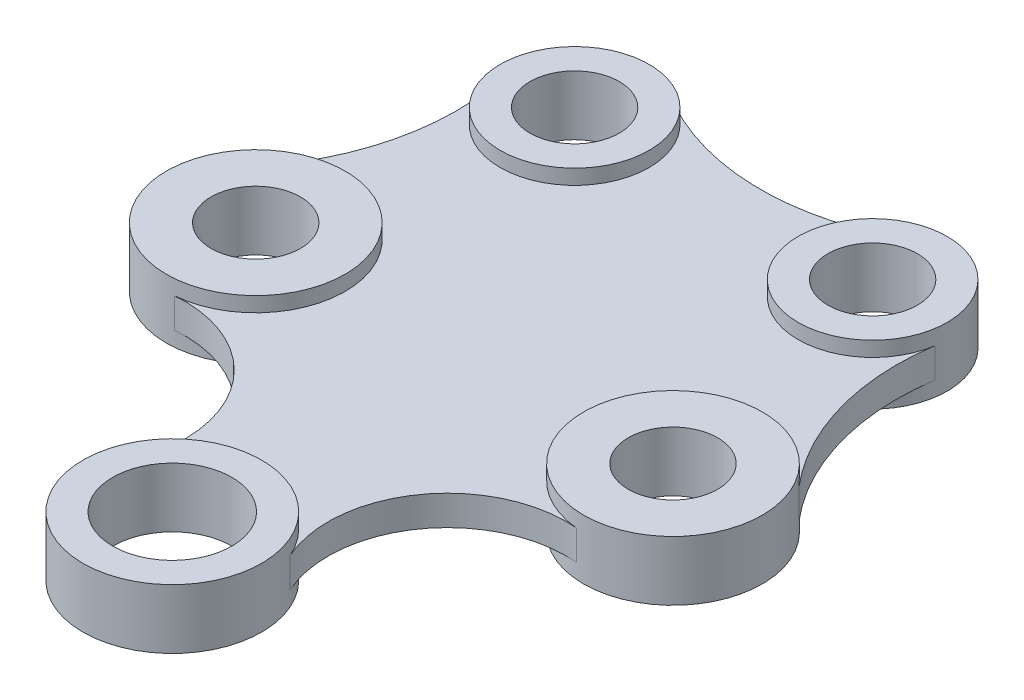
ISO-10303-21;
HEADER;
FILE_DESCRIPTION(('STEP AP214'),'2;1');
FILE_NAME('part.step','',(''),(''),'','','');
FILE_SCHEMA(('AUTOMOTIVE_DESIGN { 1 0 10303 214 1 1 1 1 }'));
ENDSEC;
DATA;
#1=APPLICATION_CONTEXT('core data for automotive mechanical design processes');
#2=APPLICATION_PROTOCOL_DEFINITION('international standard','automotive_design',2000,#1);
#3=PRODUCT_CONTEXT('',#1,'mechanical');
#4=PRODUCT('Part','Part','',(#3));
#5=PRODUCT_RELATED_PRODUCT_CATEGORY('part','',(#4));
#6=PRODUCT_DEFINITION_FORMATION('','',#4);
#7=PRODUCT_DEFINITION_CONTEXT('part definition',#1,'design');
#8=PRODUCT_DEFINITION('design','',#6,#7);
#9=PRODUCT_DEFINITION_SHAPE('','',#8);
#10=(LENGTH_UNIT() NAMED_UNIT(*) SI_UNIT(.MILLI.,.METRE.));
#11=(NAMED_UNIT(*) PLANE_ANGLE_UNIT() SI_UNIT($,.RADIAN.));
#12=(NAMED_UNIT(*) SI_UNIT($,.STERADIAN.) SOLID_ANGLE_UNIT());
#13=UNCERTAINTY_MEASURE_WITH_UNIT(LENGTH_MEASURE(1.E-05),#10,'distance_accuracy_value','');
#14=(GEOMETRIC_REPRESENTATION_CONTEXT(3) GLOBAL_UNCERTAINTY_ASSIGNED_CONTEXT((#13)) GLOBAL_UNIT_ASSIGNED_CONTEXT((#10,
#11,#12)) REPRESENTATION_CONTEXT('',''));
#15=CARTESIAN_POINT('',(0.,0.,0.));
#16=DIRECTION('',(0.,0.,1.));
#17=DIRECTION('',(1.,0.,0.));
#18=AXIS2_PLACEMENT_3D('',#15,#16,#17);
#19=CARTESIAN_POINT('',(-50.,15.,-87.));
#20=DIRECTION('',(0.,1.,0.));
#21=DIRECTION('',(0.,0.,1.));
#22=AXIS2_PLACEMENT_3D('',#19,#20,#21);
#23=PLANE('',#22);
#24=CARTESIAN_POINT('',(-50.,15.,-87.));
#25=DIRECTION('',(0.,1.,0.));
#26=DIRECTION('',(0.,0.,1.));
#27=AXIS2_PLACEMENT_3D('',#24,#25,#26);
#28=CIRCLE('',#27,15.);
#29=CARTESIAN_POINT('',(-50.,15.,-72.));
#30=VERTEX_POINT('',#29);
#31=EDGE_CURVE('E248',#30,#30,#28,.T.);
#32=ORIENTED_EDGE('',*,*,#31,.F.);
#33=EDGE_LOOP('',(#32));
#34=FACE_BOUND('',#33,.T.);
#35=CARTESIAN_POINT('',(-50.,15.,-87.));
#36=DIRECTION('',(0.,1.,0.));
#37=DIRECTION('',(0.,0.,1.));
#38=AXIS2_PLACEMENT_3D('',#35,#36,#37);
#39=CIRCLE('',#38,25.);
#40=CARTESIAN_POINT('',(-50.,15.,-62.));
#41=VERTEX_POINT('',#40);
#42=EDGE_CURVE('E278',#41,#41,#39,.T.);
#43=ORIENTED_EDGE('',*,*,#42,.T.);
#44=EDGE_LOOP('',(#43));
#45=FACE_BOUND('',#44,.T.);
#46=ADVANCED_FACE('F45',(#34,#45),#23,.T.);
#47=CARTESIAN_POINT('',(-101.905554510334,10.,-79.1219665540998));
#48=DIRECTION('',(0.,1.,0.));
#49=DIRECTION('',(0.,0.,1.));
#50=AXIS2_PLACEMENT_3D('',#47,#48,#49);
#51=PLANE('',#50);
#52=CARTESIAN_POINT('',(50.,10.,-87.));
#53=DIRECTION('',(0.,1.,0.));
#54=DIRECTION('',(0.,0.,1.));
#55=AXIS2_PLACEMENT_3D('',#52,#53,#54);
#56=CIRCLE('',#55,25.);
#57=CARTESIAN_POINT('',(38.0952380952381,10.,-108.983553943595));
#58=VERTEX_POINT('',#57);
#59=CARTESIAN_POINT('',(74.7169307192068,10.,-83.2485555019523));
#60=VERTEX_POINT('',#59);
#61=EDGE_CURVE('E151',#58,#60,#56,.T.);
#62=ORIENTED_EDGE('',*,*,#61,.F.);
#63=CARTESIAN_POINT('',(0.,10.,-179.330926563097));
#64=DIRECTION('',(0.,-1.,0.));
#65=DIRECTION('',(0.,0.,1.));
#66=AXIS2_PLACEMENT_3D('',#63,#64,#65);
#67=CIRCLE('',#66,80.);
#68=CARTESIAN_POINT('',(-38.0952380952381,10.,-108.983553943595));
#69=VERTEX_POINT('',#68);
#70=EDGE_CURVE('E173',#58,#69,#67,.T.);
#71=ORIENTED_EDGE('',*,*,#70,.T.);
#72=CARTESIAN_POINT('',(-50.,10.,-87.));
#73=DIRECTION('',(0.,1.,0.));
#74=DIRECTION('',(0.,0.,1.));
#75=AXIS2_PLACEMENT_3D('',#72,#73,#74);
#76=CIRCLE('',#75,25.);
#77=CARTESIAN_POINT('',(-74.7169307192068,10.,-83.2485555019523));
#78=VERTEX_POINT('',#77);
#79=EDGE_CURVE('E65',#78,#69,#76,.T.);
#80=ORIENTED_EDGE('',*,*,#79,.F.);
#81=CARTESIAN_POINT('',(-153.811109020668,10.,-71.2439331081996));
#82=DIRECTION('',(0.,-1.,0.));
#83=DIRECTION('',(0.,0.,1.));
#84=AXIS2_PLACEMENT_3D('',#81,#82,#83);
#85=CIRCLE('',#84,80.);
#86=CARTESIAN_POINT('',(-92.857575187455,10.,-19.4301635749635));
#87=VERTEX_POINT('',#86);
#88=EDGE_CURVE('E99',#78,#87,#85,.T.);
#89=ORIENTED_EDGE('',*,*,#88,.T.);
#90=CARTESIAN_POINT('',(-70.,10.,0.));
#91=DIRECTION('',(0.,1.,0.));
#92=DIRECTION('',(0.,0.,1.));
#93=AXIS2_PLACEMENT_3D('',#90,#91,#92);
#94=CIRCLE('',#93,30.);
#95=CARTESIAN_POINT('',(-67.4477285456402,10.,29.8912346754573));
#96=VERTEX_POINT('',#95);
#97=EDGE_CURVE('E161',#96,#87,#94,.T.);
#98=ORIENTED_EDGE('',*,*,#97,.F.);
#99=CARTESIAN_POINT('',(-64.0446999398271,10.,69.7462142427337));
#100=DIRECTION('',(0.,-1.,0.));
#101=DIRECTION('',(0.,0.,1.));
#102=AXIS2_PLACEMENT_3D('',#99,#100,#101);
#103=CIRCLE('',#102,40.);
#104=CARTESIAN_POINT('',(-27.4477285456402,10.,85.8912346754573));
#105=VERTEX_POINT('',#104);
#106=EDGE_CURVE('E124',#96,#105,#103,.T.);
#107=ORIENTED_EDGE('',*,*,#106,.T.);
#108=CARTESIAN_POINT('',(0.,10.,98.));
#109=DIRECTION('',(0.,1.,0.));
#110=DIRECTION('',(0.,0.,1.));
#111=AXIS2_PLACEMENT_3D('',#108,#109,#110);
#112=CIRCLE('',#111,30.);
#113=CARTESIAN_POINT('',(27.4477285456402,10.,85.8912346754573));
#114=VERTEX_POINT('',#113);
#115=EDGE_CURVE('E118',#114,#105,#112,.T.);
#116=ORIENTED_EDGE('',*,*,#115,.F.);
#117=CARTESIAN_POINT('',(64.0446999398271,10.,69.7462142427337));
#118=DIRECTION('',(0.,-1.,0.));
#119=DIRECTION('',(0.,0.,-1.));
#120=AXIS2_PLACEMENT_3D('',#117,#118,#119);
#121=CIRCLE('',#120,40.);
#122=CARTESIAN_POINT('',(67.4477285456402,10.,29.8912346754573));
#123=VERTEX_POINT('',#122);
#124=EDGE_CURVE('E109',#114,#123,#121,.T.);
#125=ORIENTED_EDGE('',*,*,#124,.T.);
#126=CARTESIAN_POINT('',(70.,10.,0.));
#127=DIRECTION('',(0.,1.,0.));
#128=DIRECTION('',(0.,0.,1.));
#129=AXIS2_PLACEMENT_3D('',#126,#127,#128);
#130=CIRCLE('',#129,30.);
#131=CARTESIAN_POINT('',(92.857575187455,10.,-19.4301635749635));
#132=VERTEX_POINT('',#131);
#133=EDGE_CURVE('E115',#132,#123,#130,.T.);
#134=ORIENTED_EDGE('',*,*,#133,.F.);
#135=CARTESIAN_POINT('',(153.811109020668,10.,-71.2439331081996));
#136=DIRECTION('',(0.,-1.,0.));
#137=DIRECTION('',(0.,0.,-1.));
#138=AXIS2_PLACEMENT_3D('',#135,#136,#137);
#139=CIRCLE('',#138,80.);
#140=EDGE_CURVE('E123',#132,#60,#139,.T.);
#141=ORIENTED_EDGE('',*,*,#140,.T.);
#142=EDGE_LOOP('',(#62,#71,#80,#89,#98,#107,#116,#125,#134,#141));
#143=FACE_BOUND('',#142,.T.);
#144=ADVANCED_FACE('F111',(#143),#51,.T.);
#145=CARTESIAN_POINT('',(-101.905554510334,0.,-79.1219665540998));
#146=DIRECTION('',(0.,1.,0.));
#147=DIRECTION('',(0.,0.,1.));
#148=AXIS2_PLACEMENT_3D('',#145,#146,#147);
#149=PLANE('',#148);
#150=CARTESIAN_POINT('',(0.,0.,-179.330926563097));
#151=DIRECTION('',(0.,-1.,0.));
#152=DIRECTION('',(0.,0.,1.));
#153=AXIS2_PLACEMENT_3D('',#150,#151,#152);
#154=CIRCLE('',#153,80.);
#155=CARTESIAN_POINT('',(38.0952380952381,0.,-108.983553943595));
#156=VERTEX_POINT('',#155);
#157=CARTESIAN_POINT('',(-38.0952380952381,0.,-108.983553943595));
#158=VERTEX_POINT('',#157);
#159=EDGE_CURVE('E168',#156,#158,#154,.T.);
#160=ORIENTED_EDGE('',*,*,#159,.F.);
#161=CARTESIAN_POINT('',(50.,0.,-87.));
#162=DIRECTION('',(0.,1.,0.));
#163=DIRECTION('',(0.,0.,1.));
#164=AXIS2_PLACEMENT_3D('',#161,#162,#163);
#165=CIRCLE('',#164,25.);
#166=CARTESIAN_POINT('',(74.7169307192068,0.,-83.2485555019523));
#167=VERTEX_POINT('',#166);
#168=EDGE_CURVE('E87',#156,#167,#165,.T.);
#169=ORIENTED_EDGE('',*,*,#168,.T.);
#170=CARTESIAN_POINT('',(153.811109020668,0.,-71.2439331081996));
#171=DIRECTION('',(0.,-1.,0.));
#172=DIRECTION('',(0.,0.,-1.));
#173=AXIS2_PLACEMENT_3D('',#170,#171,#172);
#174=CIRCLE('',#173,80.);
#175=CARTESIAN_POINT('',(92.8575751874551,0.,-19.4301635749635));
#176=VERTEX_POINT('',#175);
#177=EDGE_CURVE('E186',#176,#167,#174,.T.);
#178=ORIENTED_EDGE('',*,*,#177,.F.);
#179=CARTESIAN_POINT('',(70.,0.,0.));
#180=DIRECTION('',(0.,1.,0.));
#181=DIRECTION('',(0.,0.,1.));
#182=AXIS2_PLACEMENT_3D('',#179,#180,#181);
#183=CIRCLE('',#182,30.);
#184=CARTESIAN_POINT('',(67.4477285456402,0.,29.8912346754573));
#185=VERTEX_POINT('',#184);
#186=EDGE_CURVE('E144',#176,#185,#183,.T.);
#187=ORIENTED_EDGE('',*,*,#186,.T.);
#188=CARTESIAN_POINT('',(64.0446999398271,0.,69.7462142427337));
#189=DIRECTION('',(0.,-1.,0.));
#190=DIRECTION('',(0.,0.,-1.));
#191=AXIS2_PLACEMENT_3D('',#188,#189,#190);
#192=CIRCLE('',#191,40.);
#193=CARTESIAN_POINT('',(27.4477285456402,0.,85.8912346754573));
#194=VERTEX_POINT('',#193);
#195=EDGE_CURVE('E132',#194,#185,#192,.T.);
#196=ORIENTED_EDGE('',*,*,#195,.F.);
#197=CARTESIAN_POINT('',(0.,0.,98.));
#198=DIRECTION('',(0.,1.,0.));
#199=DIRECTION('',(0.,0.,1.));
#200=AXIS2_PLACEMENT_3D('',#197,#198,#199);
#201=CIRCLE('',#200,30.);
#202=CARTESIAN_POINT('',(-27.4477285456402,0.,85.8912346754573));
#203=VERTEX_POINT('',#202);
#204=EDGE_CURVE('E143',#194,#203,#201,.T.);
#205=ORIENTED_EDGE('',*,*,#204,.T.);
#206=CARTESIAN_POINT('',(-64.0446999398271,0.,69.7462142427337));
#207=DIRECTION('',(0.,-1.,0.));
#208=DIRECTION('',(0.,0.,1.));
#209=AXIS2_PLACEMENT_3D('',#206,#207,#208);
#210=CIRCLE('',#209,40.);
#211=CARTESIAN_POINT('',(-67.4477285456402,0.,29.8912346754573));
#212=VERTEX_POINT('',#211);
#213=EDGE_CURVE('E180',#212,#203,#210,.T.);
#214=ORIENTED_EDGE('',*,*,#213,.F.);
#215=CARTESIAN_POINT('',(-70.,0.,0.));
#216=DIRECTION('',(0.,1.,0.));
#217=DIRECTION('',(0.,0.,1.));
#218=AXIS2_PLACEMENT_3D('',#215,#216,#217);
#219=CIRCLE('',#218,30.);
#220=CARTESIAN_POINT('',(-92.857575187455,0.,-19.4301635749635));
#221=VERTEX_POINT('',#220);
#222=EDGE_CURVE('E157',#212,#221,#219,.T.);
#223=ORIENTED_EDGE('',*,*,#222,.T.);
#224=CARTESIAN_POINT('',(-153.811109020668,0.,-71.2439331081996));
#225=DIRECTION('',(0.,-1.,0.));
#226=DIRECTION('',(0.,0.,1.));
#227=AXIS2_PLACEMENT_3D('',#224,#225,#226);
#228=CIRCLE('',#227,80.);
#229=CARTESIAN_POINT('',(-74.7169307192068,0.,-83.2485555019523));
#230=VERTEX_POINT('',#229);
#231=EDGE_CURVE('E165',#230,#221,#228,.T.);
#232=ORIENTED_EDGE('',*,*,#231,.F.);
#233=CARTESIAN_POINT('',(-50.,0.,-87.));
#234=DIRECTION('',(0.,1.,0.));
#235=DIRECTION('',(0.,0.,1.));
#236=AXIS2_PLACEMENT_3D('',#233,#234,#235);
#237=CIRCLE('',#236,25.);
#238=EDGE_CURVE('E93',#230,#158,#237,.T.);
#239=ORIENTED_EDGE('',*,*,#238,.T.);
#240=EDGE_LOOP('',(#160,#169,#178,#187,#196,#205,#214,#223,#232,#239));
#241=FACE_BOUND('',#240,.T.);
#242=ADVANCED_FACE('F324',(#241),#149,.F.);
#243=CARTESIAN_POINT('',(-153.811109020668,10.,-71.2439331081996));
#244=DIRECTION('',(0.,-1.,0.));
#245=DIRECTION('',(0.,0.,-1.));
#246=AXIS2_PLACEMENT_3D('',#243,#244,#245);
#247=CYLINDRICAL_SURFACE('',#246,80.);
#248=ORIENTED_EDGE('',*,*,#231,.T.);
#249=DIRECTION('',(0.,-1.,0.));
#250=VECTOR('',#249,1.);
#251=CARTESIAN_POINT('',(-92.857575187455,10.,-19.4301635749635));
#252=LINE('',#251,#250);
#253=EDGE_CURVE('E11',#87,#221,#252,.T.);
#254=ORIENTED_EDGE('',*,*,#253,.F.);
#255=ORIENTED_EDGE('',*,*,#88,.F.);
#256=DIRECTION('',(0.,-1.,0.));
#257=VECTOR('',#256,1.);
#258=CARTESIAN_POINT('',(-74.7169307192068,10.,-83.2485555019523));
#259=LINE('',#258,#257);
#260=EDGE_CURVE('E176',#78,#230,#259,.T.);
#261=ORIENTED_EDGE('',*,*,#260,.T.);
#262=EDGE_LOOP('',(#248,#254,#255,#261));
#263=FACE_BOUND('',#262,.T.);
#264=ADVANCED_FACE('F47',(#263),#247,.F.);
#265=CARTESIAN_POINT('',(-70.,10.,0.));
#266=DIRECTION('',(0.,-1.,0.));
#267=DIRECTION('',(0.,0.,-1.));
#268=AXIS2_PLACEMENT_3D('',#265,#266,#267);
#269=CYLINDRICAL_SURFACE('',#268,30.);
#270=ORIENTED_EDGE('',*,*,#253,.T.);
#271=ORIENTED_EDGE('',*,*,#222,.F.);
#272=DIRECTION('',(0.,-1.,0.));
#273=VECTOR('',#272,1.);
#274=CARTESIAN_POINT('',(-67.4477285456402,10.,29.8912346754573));
#275=LINE('',#274,#273);
#276=EDGE_CURVE('E56',#96,#212,#275,.T.);
#277=ORIENTED_EDGE('',*,*,#276,.F.);
#278=ORIENTED_EDGE('',*,*,#97,.T.);
#279=EDGE_LOOP('',(#270,#271,#277,#278));
#280=FACE_BOUND('',#279,.T.);
#281=CARTESIAN_POINT('',(-70.,-5.,0.));
#282=DIRECTION('',(0.,1.,0.));
#283=DIRECTION('',(0.,0.,1.));
#284=AXIS2_PLACEMENT_3D('',#281,#282,#283);
#285=CIRCLE('',#284,30.);
#286=CARTESIAN_POINT('',(-70.,-5.,30.));
#287=VERTEX_POINT('',#286);
#288=EDGE_CURVE('E252',#287,#287,#285,.T.);
#289=ORIENTED_EDGE('',*,*,#288,.T.);
#290=EDGE_LOOP('',(#289));
#291=FACE_BOUND('',#290,.T.);
#292=CARTESIAN_POINT('',(-70.,15.,0.));
#293=DIRECTION('',(0.,1.,0.));
#294=DIRECTION('',(0.,0.,1.));
#295=AXIS2_PLACEMENT_3D('',#292,#293,#294);
#296=CIRCLE('',#295,30.);
#297=CARTESIAN_POINT('',(-70.,15.,30.));
#298=VERTEX_POINT('',#297);
#299=EDGE_CURVE('E258',#298,#298,#296,.T.);
#300=ORIENTED_EDGE('',*,*,#299,.F.);
#301=EDGE_LOOP('',(#300));
#302=FACE_BOUND('',#301,.T.);
#303=ADVANCED_FACE('F327',(#280,#291,#302),#269,.T.);
#304=CARTESIAN_POINT('',(-64.0446999398271,10.,69.7462142427337));
#305=DIRECTION('',(0.,-1.,0.));
#306=DIRECTION('',(0.,0.,-1.));
#307=AXIS2_PLACEMENT_3D('',#304,#305,#306);
#308=CYLINDRICAL_SURFACE('',#307,40.);
#309=ORIENTED_EDGE('',*,*,#213,.T.);
#310=DIRECTION('',(0.,-1.,0.));
#311=VECTOR('',#310,1.);
#312=CARTESIAN_POINT('',(-27.4477285456402,10.,85.8912346754573));
#313=LINE('',#312,#311);
#314=EDGE_CURVE('E210',#105,#203,#313,.T.);
#315=ORIENTED_EDGE('',*,*,#314,.F.);
#316=ORIENTED_EDGE('',*,*,#106,.F.);
#317=ORIENTED_EDGE('',*,*,#276,.T.);
#318=EDGE_LOOP('',(#309,#315,#316,#317));
#319=FACE_BOUND('',#318,.T.);
#320=ADVANCED_FACE('F371',(#319),#308,.F.);
#321=CARTESIAN_POINT('',(0.,10.,98.));
#322=DIRECTION('',(0.,-1.,0.));
#323=DIRECTION('',(0.,0.,-1.));
#324=AXIS2_PLACEMENT_3D('',#321,#322,#323);
#325=CYLINDRICAL_SURFACE('',#324,30.);
#326=ORIENTED_EDGE('',*,*,#314,.T.);
#327=ORIENTED_EDGE('',*,*,#204,.F.);
#328=DIRECTION('',(0.,-1.,0.));
#329=VECTOR('',#328,1.);
#330=CARTESIAN_POINT('',(27.4477285456402,10.,85.8912346754573));
#331=LINE('',#330,#329);
#332=EDGE_CURVE('E135',#114,#194,#331,.T.);
#333=ORIENTED_EDGE('',*,*,#332,.F.);
#334=ORIENTED_EDGE('',*,*,#115,.T.);
#335=EDGE_LOOP('',(#326,#327,#333,#334));
#336=FACE_BOUND('',#335,.T.);
#337=CARTESIAN_POINT('',(0.,-5.,98.));
#338=DIRECTION('',(0.,1.,0.));
#339=DIRECTION('',(0.,0.,1.));
#340=AXIS2_PLACEMENT_3D('',#337,#338,#339);
#341=CIRCLE('',#340,30.);
#342=CARTESIAN_POINT('',(0.,-5.,128.));
#343=VERTEX_POINT('',#342);
#344=EDGE_CURVE('E253',#343,#343,#341,.T.);
#345=ORIENTED_EDGE('',*,*,#344,.T.);
#346=EDGE_LOOP('',(#345));
#347=FACE_BOUND('',#346,.T.);
#348=CARTESIAN_POINT('',(0.,15.,98.));
#349=DIRECTION('',(0.,1.,0.));
#350=DIRECTION('',(0.,0.,1.));
#351=AXIS2_PLACEMENT_3D('',#348,#349,#350);
#352=CIRCLE('',#351,30.);
#353=CARTESIAN_POINT('',(0.,15.,128.));
#354=VERTEX_POINT('',#353);
#355=EDGE_CURVE('E257',#354,#354,#352,.T.);
#356=ORIENTED_EDGE('',*,*,#355,.F.);
#357=EDGE_LOOP('',(#356));
#358=FACE_BOUND('',#357,.T.);
#359=ADVANCED_FACE('F375',(#336,#347,#358),#325,.T.);
#360=CARTESIAN_POINT('',(64.0446999398271,10.,69.7462142427337));
#361=DIRECTION('',(0.,-1.,0.));
#362=DIRECTION('',(0.,0.,-1.));
#363=AXIS2_PLACEMENT_3D('',#360,#361,#362);
#364=CYLINDRICAL_SURFACE('',#363,40.);
#365=ORIENTED_EDGE('',*,*,#195,.T.);
#366=DIRECTION('',(0.,-1.,0.));
#367=VECTOR('',#366,1.);
#368=CARTESIAN_POINT('',(67.4477285456402,10.,29.8912346754573));
#369=LINE('',#368,#367);
#370=EDGE_CURVE('E128',#123,#185,#369,.T.);
#371=ORIENTED_EDGE('',*,*,#370,.F.);
#372=ORIENTED_EDGE('',*,*,#124,.F.);
#373=ORIENTED_EDGE('',*,*,#332,.T.);
#374=EDGE_LOOP('',(#365,#371,#372,#373));
#375=FACE_BOUND('',#374,.T.);
#376=ADVANCED_FACE('F129',(#375),#364,.F.);
#377=CARTESIAN_POINT('',(70.,10.,0.));
#378=DIRECTION('',(0.,-1.,0.));
#379=DIRECTION('',(0.,0.,-1.));
#380=AXIS2_PLACEMENT_3D('',#377,#378,#379);
#381=CYLINDRICAL_SURFACE('',#380,30.);
#382=ORIENTED_EDGE('',*,*,#370,.T.);
#383=ORIENTED_EDGE('',*,*,#186,.F.);
#384=DIRECTION('',(0.,-1.,0.));
#385=VECTOR('',#384,1.);
#386=CARTESIAN_POINT('',(92.8575751874551,10.,-19.4301635749635));
#387=LINE('',#386,#385);
#388=EDGE_CURVE('E136',#132,#176,#387,.T.);
#389=ORIENTED_EDGE('',*,*,#388,.F.);
#390=ORIENTED_EDGE('',*,*,#133,.T.);
#391=EDGE_LOOP('',(#382,#383,#389,#390));
#392=FACE_BOUND('',#391,.T.);
#393=CARTESIAN_POINT('',(70.,-5.,0.));
#394=DIRECTION('',(0.,1.,0.));
#395=DIRECTION('',(0.,0.,1.));
#396=AXIS2_PLACEMENT_3D('',#393,#394,#395);
#397=CIRCLE('',#396,30.);
#398=CARTESIAN_POINT('',(70.,-5.,30.));
#399=VERTEX_POINT('',#398);
#400=EDGE_CURVE('E262',#399,#399,#397,.T.);
#401=ORIENTED_EDGE('',*,*,#400,.T.);
#402=EDGE_LOOP('',(#401));
#403=FACE_BOUND('',#402,.T.);
#404=CARTESIAN_POINT('',(70.,15.,0.));
#405=DIRECTION('',(0.,1.,0.));
#406=DIRECTION('',(0.,0.,1.));
#407=AXIS2_PLACEMENT_3D('',#404,#405,#406);
#408=CIRCLE('',#407,30.);
#409=CARTESIAN_POINT('',(70.,15.,30.));
#410=VERTEX_POINT('',#409);
#411=EDGE_CURVE('E274',#410,#410,#408,.T.);
#412=ORIENTED_EDGE('',*,*,#411,.F.);
#413=EDGE_LOOP('',(#412));
#414=FACE_BOUND('',#413,.T.);
#415=ADVANCED_FACE('F139',(#392,#403,#414),#381,.T.);
#416=CARTESIAN_POINT('',(153.811109020668,10.,-71.2439331081996));
#417=DIRECTION('',(0.,-1.,0.));
#418=DIRECTION('',(0.,0.,-1.));
#419=AXIS2_PLACEMENT_3D('',#416,#417,#418);
#420=CYLINDRICAL_SURFACE('',#419,80.);
#421=ORIENTED_EDGE('',*,*,#177,.T.);
#422=DIRECTION('',(0.,-1.,0.));
#423=VECTOR('',#422,1.);
#424=CARTESIAN_POINT('',(74.7169307192068,10.,-83.2485555019523));
#425=LINE('',#424,#423);
#426=EDGE_CURVE('E202',#60,#167,#425,.T.);
#427=ORIENTED_EDGE('',*,*,#426,.F.);
#428=ORIENTED_EDGE('',*,*,#140,.F.);
#429=ORIENTED_EDGE('',*,*,#388,.T.);
#430=EDGE_LOOP('',(#421,#427,#428,#429));
#431=FACE_BOUND('',#430,.T.);
#432=ADVANCED_FACE('F311',(#431),#420,.F.);
#433=CARTESIAN_POINT('',(50.,10.,-87.));
#434=DIRECTION('',(0.,-1.,0.));
#435=DIRECTION('',(0.,0.,-1.));
#436=AXIS2_PLACEMENT_3D('',#433,#434,#435);
#437=CYLINDRICAL_SURFACE('',#436,25.);
#438=ORIENTED_EDGE('',*,*,#426,.T.);
#439=ORIENTED_EDGE('',*,*,#168,.F.);
#440=DIRECTION('',(0.,-1.,0.));
#441=VECTOR('',#440,1.);
#442=CARTESIAN_POINT('',(38.0952380952381,10.,-108.983553943595));
#443=LINE('',#442,#441);
#444=EDGE_CURVE('E198',#58,#156,#443,.T.);
#445=ORIENTED_EDGE('',*,*,#444,.F.);
#446=ORIENTED_EDGE('',*,*,#61,.T.);
#447=EDGE_LOOP('',(#438,#439,#445,#446));
#448=FACE_BOUND('',#447,.T.);
#449=CARTESIAN_POINT('',(50.,-5.,-87.));
#450=DIRECTION('',(0.,1.,0.));
#451=DIRECTION('',(0.,0.,1.));
#452=AXIS2_PLACEMENT_3D('',#449,#450,#451);
#453=CIRCLE('',#452,25.);
#454=CARTESIAN_POINT('',(50.,-5.,-62.));
#455=VERTEX_POINT('',#454);
#456=EDGE_CURVE('E269',#455,#455,#453,.T.);
#457=ORIENTED_EDGE('',*,*,#456,.T.);
#458=EDGE_LOOP('',(#457));
#459=FACE_BOUND('',#458,.T.);
#460=CARTESIAN_POINT('',(50.,15.,-87.));
#461=DIRECTION('',(0.,1.,0.));
#462=DIRECTION('',(0.,0.,1.));
#463=AXIS2_PLACEMENT_3D('',#460,#461,#462);
#464=CIRCLE('',#463,25.);
#465=CARTESIAN_POINT('',(50.,15.,-62.));
#466=VERTEX_POINT('',#465);
#467=EDGE_CURVE('E273',#466,#466,#464,.T.);
#468=ORIENTED_EDGE('',*,*,#467,.F.);
#469=EDGE_LOOP('',(#468));
#470=FACE_BOUND('',#469,.T.);
#471=ADVANCED_FACE('F302',(#448,#459,#470),#437,.T.);
#472=CARTESIAN_POINT('',(0.,10.,-179.330926563097));
#473=DIRECTION('',(0.,-1.,0.));
#474=DIRECTION('',(0.,0.,-1.));
#475=AXIS2_PLACEMENT_3D('',#472,#473,#474);
#476=CYLINDRICAL_SURFACE('',#475,80.);
#477=ORIENTED_EDGE('',*,*,#159,.T.);
#478=DIRECTION('',(0.,-1.,0.));
#479=VECTOR('',#478,1.);
#480=CARTESIAN_POINT('',(-38.0952380952381,10.,-108.983553943595));
#481=LINE('',#480,#479);
#482=EDGE_CURVE('E194',#69,#158,#481,.T.);
#483=ORIENTED_EDGE('',*,*,#482,.F.);
#484=ORIENTED_EDGE('',*,*,#70,.F.);
#485=ORIENTED_EDGE('',*,*,#444,.T.);
#486=EDGE_LOOP('',(#477,#483,#484,#485));
#487=FACE_BOUND('',#486,.T.);
#488=ADVANCED_FACE('F336',(#487),#476,.F.);
#489=CARTESIAN_POINT('',(-50.,10.,-87.));
#490=DIRECTION('',(0.,-1.,0.));
#491=DIRECTION('',(0.,0.,-1.));
#492=AXIS2_PLACEMENT_3D('',#489,#490,#491);
#493=CYLINDRICAL_SURFACE('',#492,25.);
#494=ORIENTED_EDGE('',*,*,#482,.T.);
#495=ORIENTED_EDGE('',*,*,#238,.F.);
#496=ORIENTED_EDGE('',*,*,#260,.F.);
#497=ORIENTED_EDGE('',*,*,#79,.T.);
#498=EDGE_LOOP('',(#494,#495,#496,#497));
#499=FACE_BOUND('',#498,.T.);
#500=CARTESIAN_POINT('',(-50.,-5.,-87.));
#501=DIRECTION('',(0.,1.,0.));
#502=DIRECTION('',(0.,0.,1.));
#503=AXIS2_PLACEMENT_3D('',#500,#501,#502);
#504=CIRCLE('',#503,25.);
#505=CARTESIAN_POINT('',(-50.,-5.,-62.));
#506=VERTEX_POINT('',#505);
#507=EDGE_CURVE('E288',#506,#506,#504,.T.);
#508=ORIENTED_EDGE('',*,*,#507,.T.);
#509=EDGE_LOOP('',(#508));
#510=FACE_BOUND('',#509,.T.);
#511=ORIENTED_EDGE('',*,*,#42,.F.);
#512=EDGE_LOOP('',(#511));
#513=FACE_BOUND('',#512,.T.);
#514=ADVANCED_FACE('F332',(#499,#510,#513),#493,.T.);
#515=CARTESIAN_POINT('',(-50.,-5.,-87.));
#516=DIRECTION('',(0.,1.,0.));
#517=DIRECTION('',(0.,0.,1.));
#518=AXIS2_PLACEMENT_3D('',#515,#516,#517);
#519=PLANE('',#518);
#520=CARTESIAN_POINT('',(-50.,-5.,-87.));
#521=DIRECTION('',(0.,1.,0.));
#522=DIRECTION('',(0.,0.,1.));
#523=AXIS2_PLACEMENT_3D('',#520,#521,#522);
#524=CIRCLE('',#523,15.);
#525=CARTESIAN_POINT('',(-50.,-5.,-72.));
#526=VERTEX_POINT('',#525);
#527=EDGE_CURVE('E49',#526,#526,#524,.T.);
#528=ORIENTED_EDGE('',*,*,#527,.T.);
#529=EDGE_LOOP('',(#528));
#530=FACE_BOUND('',#529,.T.);
#531=ORIENTED_EDGE('',*,*,#507,.F.);
#532=EDGE_LOOP('',(#531));
#533=FACE_BOUND('',#532,.T.);
#534=ADVANCED_FACE('F344',(#530,#533),#519,.F.);
#535=CARTESIAN_POINT('',(-70.,-5.,0.));
#536=DIRECTION('',(0.,1.,0.));
#537=DIRECTION('',(0.,0.,1.));
#538=AXIS2_PLACEMENT_3D('',#535,#536,#537);
#539=PLANE('',#538);
#540=CARTESIAN_POINT('',(-70.,-5.,0.));
#541=DIRECTION('',(0.,1.,0.));
#542=DIRECTION('',(0.,0.,1.));
#543=AXIS2_PLACEMENT_3D('',#540,#541,#542);
#544=CIRCLE('',#543,15.);
#545=CARTESIAN_POINT('',(-70.,-5.,15.));
#546=VERTEX_POINT('',#545);
#547=EDGE_CURVE('E234',#546,#546,#544,.T.);
#548=ORIENTED_EDGE('',*,*,#547,.T.);
#549=EDGE_LOOP('',(#548));
#550=FACE_BOUND('',#549,.T.);
#551=ORIENTED_EDGE('',*,*,#288,.F.);
#552=EDGE_LOOP('',(#551));
#553=FACE_BOUND('',#552,.T.);
#554=ADVANCED_FACE('F361',(#550,#553),#539,.F.);
#555=CARTESIAN_POINT('',(0.,-5.,98.));
#556=DIRECTION('',(0.,1.,0.));
#557=DIRECTION('',(0.,0.,1.));
#558=AXIS2_PLACEMENT_3D('',#555,#556,#557);
#559=PLANE('',#558);
#560=CARTESIAN_POINT('',(0.,-5.,98.));
#561=DIRECTION('',(0.,1.,0.));
#562=DIRECTION('',(0.,0.,1.));
#563=AXIS2_PLACEMENT_3D('',#560,#561,#562);
#564=CIRCLE('',#563,20.);
#565=CARTESIAN_POINT('',(0.,-5.,118.));
#566=VERTEX_POINT('',#565);
#567=EDGE_CURVE('E230',#566,#566,#564,.T.);
#568=ORIENTED_EDGE('',*,*,#567,.T.);
#569=EDGE_LOOP('',(#568));
#570=FACE_BOUND('',#569,.T.);
#571=ORIENTED_EDGE('',*,*,#344,.F.);
#572=EDGE_LOOP('',(#571));
#573=FACE_BOUND('',#572,.T.);
#574=ADVANCED_FACE('F426',(#570,#573),#559,.F.);
#575=CARTESIAN_POINT('',(70.,-5.,0.));
#576=DIRECTION('',(0.,1.,0.));
#577=DIRECTION('',(0.,0.,1.));
#578=AXIS2_PLACEMENT_3D('',#575,#576,#577);
#579=PLANE('',#578);
#580=CARTESIAN_POINT('',(70.,-5.,0.));
#581=DIRECTION('',(0.,1.,0.));
#582=DIRECTION('',(0.,0.,1.));
#583=AXIS2_PLACEMENT_3D('',#580,#581,#582);
#584=CIRCLE('',#583,15.);
#585=CARTESIAN_POINT('',(70.,-5.,15.));
#586=VERTEX_POINT('',#585);
#587=EDGE_CURVE('E226',#586,#586,#584,.F.);
#588=ORIENTED_EDGE('',*,*,#587,.F.);
#589=EDGE_LOOP('',(#588));
#590=FACE_BOUND('',#589,.T.);
#591=ORIENTED_EDGE('',*,*,#400,.F.);
#592=EDGE_LOOP('',(#591));
#593=FACE_BOUND('',#592,.T.);
#594=ADVANCED_FACE('F436',(#590,#593),#579,.F.);
#595=CARTESIAN_POINT('',(50.,-5.,-87.));
#596=DIRECTION('',(0.,1.,0.));
#597=DIRECTION('',(0.,0.,1.));
#598=AXIS2_PLACEMENT_3D('',#595,#596,#597);
#599=PLANE('',#598);
#600=CARTESIAN_POINT('',(50.,-5.,-87.));
#601=DIRECTION('',(0.,1.,0.));
#602=DIRECTION('',(0.,0.,1.));
#603=AXIS2_PLACEMENT_3D('',#600,#601,#602);
#604=CIRCLE('',#603,15.);
#605=CARTESIAN_POINT('',(50.,-5.,-72.));
#606=VERTEX_POINT('',#605);
#607=EDGE_CURVE('E221',#606,#606,#604,.F.);
#608=ORIENTED_EDGE('',*,*,#607,.F.);
#609=EDGE_LOOP('',(#608));
#610=FACE_BOUND('',#609,.T.);
#611=ORIENTED_EDGE('',*,*,#456,.F.);
#612=EDGE_LOOP('',(#611));
#613=FACE_BOUND('',#612,.T.);
#614=ADVANCED_FACE('F445',(#610,#613),#599,.F.);
#615=CARTESIAN_POINT('',(-70.,15.,0.));
#616=DIRECTION('',(0.,1.,0.));
#617=DIRECTION('',(0.,0.,1.));
#618=AXIS2_PLACEMENT_3D('',#615,#616,#617);
#619=PLANE('',#618);
#620=CARTESIAN_POINT('',(-70.,15.,0.));
#621=DIRECTION('',(0.,1.,0.));
#622=DIRECTION('',(0.,0.,1.));
#623=AXIS2_PLACEMENT_3D('',#620,#621,#622);
#624=CIRCLE('',#623,15.);
#625=CARTESIAN_POINT('',(-70.,15.,15.));
#626=VERTEX_POINT('',#625);
#627=EDGE_CURVE('E231',#626,#626,#624,.T.);
#628=ORIENTED_EDGE('',*,*,#627,.F.);
#629=EDGE_LOOP('',(#628));
#630=FACE_BOUND('',#629,.T.);
#631=ORIENTED_EDGE('',*,*,#299,.T.);
#632=EDGE_LOOP('',(#631));
#633=FACE_BOUND('',#632,.T.);
#634=ADVANCED_FACE('F454',(#630,#633),#619,.T.);
#635=CARTESIAN_POINT('',(0.,15.,98.));
#636=DIRECTION('',(0.,1.,0.));
#637=DIRECTION('',(0.,0.,1.));
#638=AXIS2_PLACEMENT_3D('',#635,#636,#637);
#639=PLANE('',#638);
#640=CARTESIAN_POINT('',(0.,15.,98.));
#641=DIRECTION('',(0.,1.,0.));
#642=DIRECTION('',(0.,0.,1.));
#643=AXIS2_PLACEMENT_3D('',#640,#641,#642);
#644=CIRCLE('',#643,20.);
#645=CARTESIAN_POINT('',(0.,15.,118.));
#646=VERTEX_POINT('',#645);
#647=EDGE_CURVE('E227',#646,#646,#644,.T.);
#648=ORIENTED_EDGE('',*,*,#647,.F.);
#649=EDGE_LOOP('',(#648));
#650=FACE_BOUND('',#649,.T.);
#651=ORIENTED_EDGE('',*,*,#355,.T.);
#652=EDGE_LOOP('',(#651));
#653=FACE_BOUND('',#652,.T.);
#654=ADVANCED_FACE('F464',(#650,#653),#639,.T.);
#655=CARTESIAN_POINT('',(70.,15.,0.));
#656=DIRECTION('',(0.,1.,0.));
#657=DIRECTION('',(0.,0.,1.));
#658=AXIS2_PLACEMENT_3D('',#655,#656,#657);
#659=PLANE('',#658);
#660=CARTESIAN_POINT('',(70.,15.,0.));
#661=DIRECTION('',(0.,1.,0.));
#662=DIRECTION('',(0.,0.,1.));
#663=AXIS2_PLACEMENT_3D('',#660,#661,#662);
#664=CIRCLE('',#663,15.);
#665=CARTESIAN_POINT('',(70.,15.,15.));
#666=VERTEX_POINT('',#665);
#667=EDGE_CURVE('E222',#666,#666,#664,.F.);
#668=ORIENTED_EDGE('',*,*,#667,.T.);
#669=EDGE_LOOP('',(#668));
#670=FACE_BOUND('',#669,.T.);
#671=ORIENTED_EDGE('',*,*,#411,.T.);
#672=EDGE_LOOP('',(#671));
#673=FACE_BOUND('',#672,.T.);
#674=ADVANCED_FACE('F359',(#670,#673),#659,.T.);
#675=CARTESIAN_POINT('',(50.,15.,-87.));
#676=DIRECTION('',(0.,1.,0.));
#677=DIRECTION('',(0.,0.,1.));
#678=AXIS2_PLACEMENT_3D('',#675,#676,#677);
#679=PLANE('',#678);
#680=CARTESIAN_POINT('',(50.,15.,-87.));
#681=DIRECTION('',(0.,1.,0.));
#682=DIRECTION('',(0.,0.,1.));
#683=AXIS2_PLACEMENT_3D('',#680,#681,#682);
#684=CIRCLE('',#683,15.);
#685=CARTESIAN_POINT('',(50.,15.,-72.));
#686=VERTEX_POINT('',#685);
#687=EDGE_CURVE('E217',#686,#686,#684,.F.);
#688=ORIENTED_EDGE('',*,*,#687,.T.);
#689=EDGE_LOOP('',(#688));
#690=FACE_BOUND('',#689,.T.);
#691=ORIENTED_EDGE('',*,*,#467,.T.);
#692=EDGE_LOOP('',(#691));
#693=FACE_BOUND('',#692,.T.);
#694=ADVANCED_FACE('F483',(#690,#693),#679,.T.);
#695=CARTESIAN_POINT('',(50.,-25.,-87.));
#696=DIRECTION('',(0.,1.,0.));
#697=DIRECTION('',(0.,0.,1.));
#698=AXIS2_PLACEMENT_3D('',#695,#696,#697);
#699=CYLINDRICAL_SURFACE('',#698,15.);
#700=ORIENTED_EDGE('',*,*,#687,.F.);
#701=EDGE_LOOP('',(#700));
#702=FACE_BOUND('',#701,.T.);
#703=ORIENTED_EDGE('',*,*,#607,.T.);
#704=EDGE_LOOP('',(#703));
#705=FACE_BOUND('',#704,.T.);
#706=ADVANCED_FACE('F492',(#702,#705),#699,.F.);
#707=CARTESIAN_POINT('',(70.,-25.,0.));
#708=DIRECTION('',(0.,1.,0.));
#709=DIRECTION('',(0.,0.,1.));
#710=AXIS2_PLACEMENT_3D('',#707,#708,#709);
#711=CYLINDRICAL_SURFACE('',#710,15.);
#712=ORIENTED_EDGE('',*,*,#667,.F.);
#713=EDGE_LOOP('',(#712));
#714=FACE_BOUND('',#713,.T.);
#715=ORIENTED_EDGE('',*,*,#587,.T.);
#716=EDGE_LOOP('',(#715));
#717=FACE_BOUND('',#716,.T.);
#718=ADVANCED_FACE('F502',(#714,#717),#711,.F.);
#719=CARTESIAN_POINT('',(0.,-25.,98.));
#720=DIRECTION('',(0.,1.,0.));
#721=DIRECTION('',(0.,0.,1.));
#722=AXIS2_PLACEMENT_3D('',#719,#720,#721);
#723=CYLINDRICAL_SURFACE('',#722,20.);
#724=ORIENTED_EDGE('',*,*,#647,.T.);
#725=EDGE_LOOP('',(#724));
#726=FACE_BOUND('',#725,.T.);
#727=ORIENTED_EDGE('',*,*,#567,.F.);
#728=EDGE_LOOP('',(#727));
#729=FACE_BOUND('',#728,.T.);
#730=ADVANCED_FACE('F512',(#726,#729),#723,.F.);
#731=CARTESIAN_POINT('',(-70.,-25.,0.));
#732=DIRECTION('',(0.,1.,0.));
#733=DIRECTION('',(0.,0.,1.));
#734=AXIS2_PLACEMENT_3D('',#731,#732,#733);
#735=CYLINDRICAL_SURFACE('',#734,15.);
#736=ORIENTED_EDGE('',*,*,#627,.T.);
#737=EDGE_LOOP('',(#736));
#738=FACE_BOUND('',#737,.T.);
#739=ORIENTED_EDGE('',*,*,#547,.F.);
#740=EDGE_LOOP('',(#739));
#741=FACE_BOUND('',#740,.T.);
#742=ADVANCED_FACE('F522',(#738,#741),#735,.F.);
#743=CARTESIAN_POINT('',(-50.,-25.,-87.));
#744=DIRECTION('',(0.,1.,0.));
#745=DIRECTION('',(0.,0.,1.));
#746=AXIS2_PLACEMENT_3D('',#743,#744,#745);
#747=CYLINDRICAL_SURFACE('',#746,15.);
#748=ORIENTED_EDGE('',*,*,#31,.T.);
#749=EDGE_LOOP('',(#748));
#750=FACE_BOUND('',#749,.T.);
#751=ORIENTED_EDGE('',*,*,#527,.F.);
#752=EDGE_LOOP('',(#751));
#753=FACE_BOUND('',#752,.T.);
#754=ADVANCED_FACE('F532',(#750,#753),#747,.F.);
#755=CLOSED_SHELL('',(#46,#144,#242,#264,#303,#320,#359,#376,#415,#432,#471,#488,#514,#534,#554,
#574,#594,#614,#634,#654,#674,#694,#706,#718,#730,#742,#754));
#756=MANIFOLD_SOLID_BREP('B2',#755);
#757=ADVANCED_BREP_SHAPE_REPRESENTATION('',(#18,#756),#14);
#758=SHAPE_DEFINITION_REPRESENTATION(#9,#757);
ENDSEC;
END-ISO-10303-21;
